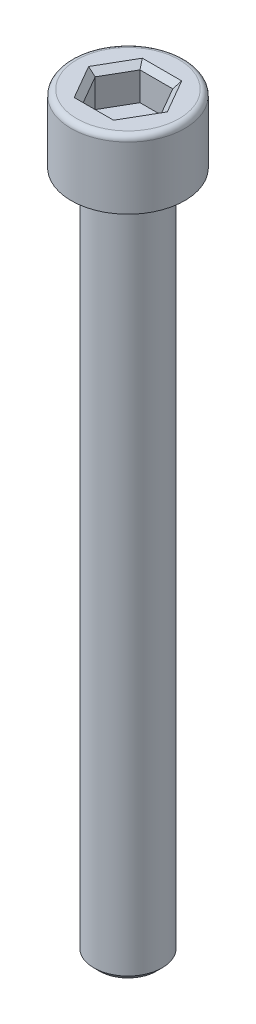
ISO-10303-21;
HEADER;
FILE_DESCRIPTION(('STEP AP214'),'2;1');
FILE_NAME('part.step','',(''),(''),'','','');
FILE_SCHEMA(('AUTOMOTIVE_DESIGN { 1 0 10303 214 1 1 1 1 }'));
ENDSEC;
DATA;
#1=APPLICATION_CONTEXT('core data for automotive mechanical design processes');
#2=APPLICATION_PROTOCOL_DEFINITION('international standard','automotive_design',2000,#1);
#3=PRODUCT_CONTEXT('',#1,'mechanical');
#4=PRODUCT('Part','Part','',(#3));
#5=PRODUCT_RELATED_PRODUCT_CATEGORY('part','',(#4));
#6=PRODUCT_DEFINITION_FORMATION('','',#4);
#7=PRODUCT_DEFINITION_CONTEXT('part definition',#1,'design');
#8=PRODUCT_DEFINITION('design','',#6,#7);
#9=PRODUCT_DEFINITION_SHAPE('','',#8);
#10=(LENGTH_UNIT() NAMED_UNIT(*) SI_UNIT(.MILLI.,.METRE.));
#11=(NAMED_UNIT(*) PLANE_ANGLE_UNIT() SI_UNIT($,.RADIAN.));
#12=(NAMED_UNIT(*) SI_UNIT($,.STERADIAN.) SOLID_ANGLE_UNIT());
#13=UNCERTAINTY_MEASURE_WITH_UNIT(LENGTH_MEASURE(1.E-05),#10,'distance_accuracy_value','');
#14=(GEOMETRIC_REPRESENTATION_CONTEXT(3) GLOBAL_UNCERTAINTY_ASSIGNED_CONTEXT((#13)) GLOBAL_UNIT_ASSIGNED_CONTEXT((#10,
#11,#12)) REPRESENTATION_CONTEXT('',''));
#15=CARTESIAN_POINT('',(0.,0.,0.));
#16=DIRECTION('',(0.,0.,1.));
#17=DIRECTION('',(1.,0.,0.));
#18=AXIS2_PLACEMENT_3D('',#15,#16,#17);
#19=CARTESIAN_POINT('',(0.,-60.,0.));
#20=DIRECTION('',(0.,1.,0.));
#21=DIRECTION('',(0.,0.,1.));
#22=AXIS2_PLACEMENT_3D('',#19,#20,#21);
#23=CYLINDRICAL_SURFACE('',#22,3.);
#24=CARTESIAN_POINT('',(0.,-59.5,0.));
#25=DIRECTION('',(0.,1.,0.));
#26=DIRECTION('',(0.,0.,1.));
#27=AXIS2_PLACEMENT_3D('',#24,#25,#26);
#28=CIRCLE('',#27,3.);
#29=CARTESIAN_POINT('',(0.,-59.5,3.));
#30=VERTEX_POINT('',#29);
#31=EDGE_CURVE('E41',#30,#30,#28,.T.);
#32=CARTESIAN_POINT('',(0.,0.,0.));
#33=DIRECTION('',(0.,1.,0.));
#34=DIRECTION('',(0.,0.,1.));
#35=AXIS2_PLACEMENT_3D('',#32,#33,#34);
#36=CIRCLE('',#35,3.);
#37=CARTESIAN_POINT('',(0.,0.,3.));
#38=VERTEX_POINT('',#37);
#39=EDGE_CURVE('E153',#38,#38,#36,.T.);
#40=CARTESIAN_POINT('',(0.,-59.5,3.));
#41=CARTESIAN_POINT('',(0.,-58.8802083333333,3.));
#42=CARTESIAN_POINT('',(0.,-58.2604166666666,3.));
#43=CARTESIAN_POINT('',(0.,-57.0208333333333,3.));
#44=CARTESIAN_POINT('',(0.,-56.4010416666666,3.));
#45=CARTESIAN_POINT('',(0.,-55.1614583333333,3.));
#46=CARTESIAN_POINT('',(0.,-54.5416666666666,3.));
#47=CARTESIAN_POINT('',(0.,-53.3020833333333,3.));
#48=CARTESIAN_POINT('',(0.,-52.6822916666666,3.));
#49=CARTESIAN_POINT('',(0.,-51.4427083333333,3.));
#50=CARTESIAN_POINT('',(0.,-50.8229166666666,3.));
#51=CARTESIAN_POINT('',(0.,-49.5833333333333,3.));
#52=CARTESIAN_POINT('',(0.,-48.9635416666666,3.));
#53=CARTESIAN_POINT('',(0.,-47.7239583333333,3.));
#54=CARTESIAN_POINT('',(0.,-47.1041666666666,3.));
#55=CARTESIAN_POINT('',(0.,-45.8645833333333,3.));
#56=CARTESIAN_POINT('',(0.,-45.2447916666666,3.));
#57=CARTESIAN_POINT('',(0.,-44.0052083333333,3.));
#58=CARTESIAN_POINT('',(0.,-43.3854166666666,3.));
#59=CARTESIAN_POINT('',(0.,-42.1458333333333,3.));
#60=CARTESIAN_POINT('',(0.,-41.5260416666666,3.));
#61=CARTESIAN_POINT('',(0.,-40.2864583333333,3.));
#62=CARTESIAN_POINT('',(0.,-39.6666666666667,3.));
#63=CARTESIAN_POINT('',(0.,-38.4270833333333,3.));
#64=CARTESIAN_POINT('',(0.,-37.8072916666667,3.));
#65=CARTESIAN_POINT('',(0.,-36.5677083333333,3.));
#66=CARTESIAN_POINT('',(0.,-35.9479166666667,3.));
#67=CARTESIAN_POINT('',(0.,-34.7083333333333,3.));
#68=CARTESIAN_POINT('',(0.,-34.0885416666667,3.));
#69=CARTESIAN_POINT('',(0.,-32.8489583333333,3.));
#70=CARTESIAN_POINT('',(0.,-32.2291666666667,3.));
#71=CARTESIAN_POINT('',(0.,-30.9895833333333,3.));
#72=CARTESIAN_POINT('',(0.,-30.3697916666667,3.));
#73=CARTESIAN_POINT('',(0.,-29.1302083333333,3.));
#74=CARTESIAN_POINT('',(0.,-28.5104166666667,3.));
#75=CARTESIAN_POINT('',(0.,-27.2708333333333,3.));
#76=CARTESIAN_POINT('',(0.,-26.6510416666667,3.));
#77=CARTESIAN_POINT('',(0.,-25.4114583333333,3.));
#78=CARTESIAN_POINT('',(0.,-24.7916666666667,3.));
#79=CARTESIAN_POINT('',(0.,-23.5520833333333,3.));
#80=CARTESIAN_POINT('',(0.,-22.9322916666667,3.));
#81=CARTESIAN_POINT('',(0.,-21.6927083333333,3.));
#82=CARTESIAN_POINT('',(0.,-21.0729166666667,3.));
#83=CARTESIAN_POINT('',(0.,-19.8333333333333,3.));
#84=CARTESIAN_POINT('',(0.,-19.2135416666667,3.));
#85=CARTESIAN_POINT('',(0.,-17.9739583333333,3.));
#86=CARTESIAN_POINT('',(0.,-17.3541666666667,3.));
#87=CARTESIAN_POINT('',(0.,-16.1145833333333,3.));
#88=CARTESIAN_POINT('',(0.,-15.4947916666667,3.));
#89=CARTESIAN_POINT('',(0.,-14.2552083333333,3.));
#90=CARTESIAN_POINT('',(0.,-13.6354166666667,3.));
#91=CARTESIAN_POINT('',(0.,-12.3958333333333,3.));
#92=CARTESIAN_POINT('',(0.,-11.7760416666667,3.));
#93=CARTESIAN_POINT('',(0.,-10.5364583333333,3.));
#94=CARTESIAN_POINT('',(0.,-9.91666666666666,3.));
#95=CARTESIAN_POINT('',(0.,-8.67708333333333,3.));
#96=CARTESIAN_POINT('',(0.,-8.05729166666667,3.));
#97=CARTESIAN_POINT('',(0.,-6.81770833333333,3.));
#98=CARTESIAN_POINT('',(0.,-6.19791666666666,3.));
#99=CARTESIAN_POINT('',(0.,-4.95833333333333,3.));
#100=CARTESIAN_POINT('',(0.,-4.33854166666667,3.));
#101=CARTESIAN_POINT('',(0.,-3.09895833333333,3.));
#102=CARTESIAN_POINT('',(0.,-2.47916666666666,3.));
#103=CARTESIAN_POINT('',(0.,-1.23958333333333,3.));
#104=CARTESIAN_POINT('',(0.,-0.619791666666667,3.));
#105=CARTESIAN_POINT('',(0.,0.,3.));
#106=B_SPLINE_CURVE_WITH_KNOTS('',3,(#40,#41,#42,#43,#44,#45,#46,#47,#48,#49,#50,#51,#52,#53,
#54,#55,#56,#57,#58,#59,#60,#61,#62,#63,#64,#65,#66,#67,#68,#69,#70,#71,#72,#73,#74,#75,#76,#77,
#78,#79,#80,#81,#82,#83,#84,#85,#86,#87,#88,#89,#90,#91,#92,#93,#94,#95,#96,#97,#98,#99,#100,
#101,#102,#103,#104,#105),.UNSPECIFIED.,.F.,.F.,(4,2,2,2,2,2,2,2,2,2,2,2,2,2,2,2,2,2,2,2,2,2,2,
2,2,2,2,2,2,2,2,2,4),(0.,1.859375,3.71874999999999,5.578125,7.43749999999999,9.29687499999999,
11.15625,13.015625,14.875,16.734375,18.59375,20.453125,22.3125,24.171875,26.03125,27.890625,
29.75,31.609375,33.46875,35.328125,37.1875,39.046875,40.90625,42.765625,44.625,46.484375,
48.34375,50.203125,52.0625,53.921875,55.78125,57.640625,59.5),.UNSPECIFIED.);
#107=EDGE_CURVE('BSEAM33',#30,#38,#106,.T.);
#108=ORIENTED_EDGE('',*,*,#31,.T.);
#109=ORIENTED_EDGE('',*,*,#39,.F.);
#110=ORIENTED_EDGE('',*,*,#107,.T.);
#111=ORIENTED_EDGE('',*,*,#107,.F.);
#112=EDGE_LOOP('',(#108,#110,#109,#111));
#113=FACE_BOUND('',#112,.T.);
#114=ADVANCED_FACE('F33',(#113),#23,.T.);
#115=CARTESIAN_POINT('',(0.,-60.,0.));
#116=DIRECTION('',(0.,1.,0.));
#117=DIRECTION('',(0.,0.,1.));
#118=AXIS2_PLACEMENT_3D('',#115,#116,#117);
#119=PLANE('',#118);
#120=CARTESIAN_POINT('',(0.,-60.,0.));
#121=DIRECTION('',(0.,1.,0.));
#122=DIRECTION('',(0.,0.,1.));
#123=AXIS2_PLACEMENT_3D('',#120,#121,#122);
#124=CIRCLE('',#123,2.49999999999996);
#125=CARTESIAN_POINT('',(0.,-60.,2.49999999999996));
#126=VERTEX_POINT('',#125);
#127=EDGE_CURVE('E11',#126,#126,#124,.F.);
#128=ORIENTED_EDGE('',*,*,#127,.T.);
#129=EDGE_LOOP('',(#128));
#130=FACE_BOUND('',#129,.T.);
#131=ADVANCED_FACE('F213',(#130),#119,.F.);
#132=CARTESIAN_POINT('',(0.,6.,0.));
#133=DIRECTION('',(0.,-1.,0.));
#134=DIRECTION('',(0.,0.,-1.));
#135=AXIS2_PLACEMENT_3D('',#132,#133,#134);
#136=CYLINDRICAL_SURFACE('',#135,5.);
#137=CARTESIAN_POINT('',(0.,5.5,0.));
#138=DIRECTION('',(0.,1.,0.));
#139=DIRECTION('',(0.,0.,1.));
#140=AXIS2_PLACEMENT_3D('',#137,#138,#139);
#141=CIRCLE('',#140,5.);
#142=CARTESIAN_POINT('',(0.,5.5,5.));
#143=VERTEX_POINT('',#142);
#144=EDGE_CURVE('E159',#143,#143,#141,.F.);
#145=ORIENTED_EDGE('',*,*,#144,.T.);
#146=EDGE_LOOP('',(#145));
#147=FACE_BOUND('',#146,.T.);
#148=CARTESIAN_POINT('',(0.,0.,0.));
#149=DIRECTION('',(0.,1.,0.));
#150=DIRECTION('',(0.,0.,1.));
#151=AXIS2_PLACEMENT_3D('',#148,#149,#150);
#152=CIRCLE('',#151,5.);
#153=CARTESIAN_POINT('',(0.,0.,5.));
#154=VERTEX_POINT('',#153);
#155=EDGE_CURVE('E141',#154,#154,#152,.T.);
#156=ORIENTED_EDGE('',*,*,#155,.T.);
#157=EDGE_LOOP('',(#156));
#158=FACE_BOUND('',#157,.T.);
#159=ADVANCED_FACE('F218',(#147,#158),#136,.T.);
#160=CARTESIAN_POINT('',(0.,6.,0.));
#161=DIRECTION('',(0.,1.,0.));
#162=DIRECTION('',(0.,0.,1.));
#163=AXIS2_PLACEMENT_3D('',#160,#161,#162);
#164=PLANE('',#163);
#165=DIRECTION('',(-1.,0.,0.));
#166=VECTOR('',#165,1.);
#167=CARTESIAN_POINT('',(-1.44337567297406,6.,3.));
#168=LINE('',#167,#166);
#169=CARTESIAN_POINT('',(1.73205080756888,6.,3.));
#170=VERTEX_POINT('',#169);
#171=CARTESIAN_POINT('',(-1.73205080756888,6.,3.));
#172=VERTEX_POINT('',#171);
#173=EDGE_CURVE('E165',#170,#172,#168,.T.);
#174=ORIENTED_EDGE('',*,*,#173,.T.);
#175=DIRECTION('',(-0.5,0.,-0.866025403784439));
#176=VECTOR('',#175,1.);
#177=CARTESIAN_POINT('',(-3.31976404784035,6.,0.250000000000001));
#178=LINE('',#177,#176);
#179=CARTESIAN_POINT('',(-3.46410161513776,6.,0.));
#180=VERTEX_POINT('',#179);
#181=EDGE_CURVE('E175',#172,#180,#178,.T.);
#182=ORIENTED_EDGE('',*,*,#181,.T.);
#183=DIRECTION('',(0.5,0.,-0.866025403784439));
#184=VECTOR('',#183,1.);
#185=CARTESIAN_POINT('',(-1.87638837486629,6.,-2.75));
#186=LINE('',#185,#184);
#187=CARTESIAN_POINT('',(-1.73205080756888,6.,-3.));
#188=VERTEX_POINT('',#187);
#189=EDGE_CURVE('E173',#180,#188,#186,.T.);
#190=ORIENTED_EDGE('',*,*,#189,.T.);
#191=DIRECTION('',(1.,0.,0.));
#192=VECTOR('',#191,1.);
#193=CARTESIAN_POINT('',(1.44337567297407,6.,-3.));
#194=LINE('',#193,#192);
#195=CARTESIAN_POINT('',(1.73205080756888,6.,-3.));
#196=VERTEX_POINT('',#195);
#197=EDGE_CURVE('E171',#188,#196,#194,.T.);
#198=ORIENTED_EDGE('',*,*,#197,.T.);
#199=DIRECTION('',(0.5,0.,0.866025403784439));
#200=VECTOR('',#199,1.);
#201=CARTESIAN_POINT('',(3.31976404784035,6.,-0.250000000000001));
#202=LINE('',#201,#200);
#203=CARTESIAN_POINT('',(3.46410161513776,6.,0.));
#204=VERTEX_POINT('',#203);
#205=EDGE_CURVE('E169',#196,#204,#202,.T.);
#206=ORIENTED_EDGE('',*,*,#205,.T.);
#207=DIRECTION('',(-0.5,0.,0.866025403784439));
#208=VECTOR('',#207,1.);
#209=CARTESIAN_POINT('',(1.87638837486629,6.,2.75));
#210=LINE('',#209,#208);
#211=EDGE_CURVE('E167',#204,#170,#210,.T.);
#212=ORIENTED_EDGE('',*,*,#211,.T.);
#213=EDGE_LOOP('',(#174,#182,#190,#198,#206,#212));
#214=FACE_BOUND('',#213,.T.);
#215=CARTESIAN_POINT('',(0.,6.,0.));
#216=DIRECTION('',(0.,1.,0.));
#217=DIRECTION('',(0.,0.,1.));
#218=AXIS2_PLACEMENT_3D('',#215,#216,#217);
#219=CIRCLE('',#218,4.5);
#220=CARTESIAN_POINT('',(0.,6.,4.5));
#221=VERTEX_POINT('',#220);
#222=EDGE_CURVE('E156',#221,#221,#219,.T.);
#223=ORIENTED_EDGE('',*,*,#222,.T.);
#224=EDGE_LOOP('',(#223));
#225=FACE_BOUND('',#224,.T.);
#226=ADVANCED_FACE('F256',(#214,#225),#164,.T.);
#227=CARTESIAN_POINT('',(0.,0.,0.));
#228=DIRECTION('',(0.,1.,0.));
#229=DIRECTION('',(0.,0.,1.));
#230=AXIS2_PLACEMENT_3D('',#227,#228,#229);
#231=PLANE('',#230);
#232=ORIENTED_EDGE('',*,*,#39,.T.);
#233=EDGE_LOOP('',(#232));
#234=FACE_BOUND('',#233,.T.);
#235=ORIENTED_EDGE('',*,*,#155,.F.);
#236=EDGE_LOOP('',(#235));
#237=FACE_BOUND('',#236,.T.);
#238=ADVANCED_FACE('F225',(#234,#237),#231,.F.);
#239=CARTESIAN_POINT('',(0.,5.5,0.));
#240=DIRECTION('',(0.,1.,0.));
#241=DIRECTION('',(0.,0.,1.));
#242=AXIS2_PLACEMENT_3D('',#239,#240,#241);
#243=TOROIDAL_SURFACE('',#242,4.5,0.5);
#244=ORIENTED_EDGE('',*,*,#144,.F.);
#245=EDGE_LOOP('',(#244));
#246=FACE_BOUND('',#245,.T.);
#247=ORIENTED_EDGE('',*,*,#222,.F.);
#248=EDGE_LOOP('',(#247));
#249=FACE_BOUND('',#248,.T.);
#250=ADVANCED_FACE('F223',(#246,#249),#243,.T.);
#251=CARTESIAN_POINT('',(1.44337567297407,3.,2.5));
#252=DIRECTION('',(0.866025403784439,0.,0.5));
#253=DIRECTION('',(0.5,0.,-0.866025403784439));
#254=AXIS2_PLACEMENT_3D('',#251,#252,#253);
#255=PLANE('',#254);
#256=DIRECTION('',(0.,1.,0.));
#257=VECTOR('',#256,1.);
#258=CARTESIAN_POINT('',(1.44337567297407,3.,2.5));
#259=LINE('',#258,#257);
#260=CARTESIAN_POINT('',(1.44337567297407,3.,2.5));
#261=VERTEX_POINT('',#260);
#262=CARTESIAN_POINT('',(1.44337567297407,5.50000000000001,2.5));
#263=VERTEX_POINT('',#262);
#264=EDGE_CURVE('E139',#261,#263,#259,.T.);
#265=ORIENTED_EDGE('',*,*,#264,.T.);
#266=DIRECTION('',(0.5,0.,-0.866025403784439));
#267=VECTOR('',#266,1.);
#268=CARTESIAN_POINT('',(2.88675134594813,5.50000000000001,0.));
#269=LINE('',#268,#267);
#270=CARTESIAN_POINT('',(2.88675134594813,5.50000000000001,0.));
#271=VERTEX_POINT('',#270);
#272=EDGE_CURVE('E55',#263,#271,#269,.T.);
#273=ORIENTED_EDGE('',*,*,#272,.T.);
#274=DIRECTION('',(0.,1.,0.));
#275=VECTOR('',#274,1.);
#276=CARTESIAN_POINT('',(2.88675134594813,3.,0.));
#277=LINE('',#276,#275);
#278=CARTESIAN_POINT('',(2.88675134594813,3.,0.));
#279=VERTEX_POINT('',#278);
#280=EDGE_CURVE('E103',#279,#271,#277,.T.);
#281=ORIENTED_EDGE('',*,*,#280,.F.);
#282=DIRECTION('',(0.5,0.,-0.866025403784439));
#283=VECTOR('',#282,1.);
#284=CARTESIAN_POINT('',(1.44337567297407,3.,2.5));
#285=LINE('',#284,#283);
#286=EDGE_CURVE('E107',#261,#279,#285,.T.);
#287=ORIENTED_EDGE('',*,*,#286,.F.);
#288=EDGE_LOOP('',(#265,#273,#281,#287));
#289=FACE_BOUND('',#288,.T.);
#290=ADVANCED_FACE('F105',(#289),#255,.F.);
#291=CARTESIAN_POINT('',(-1.44337567297406,3.,2.5));
#292=DIRECTION('',(0.,0.,1.));
#293=DIRECTION('',(1.,0.,0.));
#294=AXIS2_PLACEMENT_3D('',#291,#292,#293);
#295=PLANE('',#294);
#296=DIRECTION('',(0.,1.,0.));
#297=VECTOR('',#296,1.);
#298=CARTESIAN_POINT('',(-1.44337567297406,3.,2.5));
#299=LINE('',#298,#297);
#300=CARTESIAN_POINT('',(-1.44337567297406,3.,2.5));
#301=VERTEX_POINT('',#300);
#302=CARTESIAN_POINT('',(-1.44337567297406,5.50000000000001,2.5));
#303=VERTEX_POINT('',#302);
#304=EDGE_CURVE('E142',#301,#303,#299,.T.);
#305=ORIENTED_EDGE('',*,*,#304,.T.);
#306=DIRECTION('',(1.,0.,0.));
#307=VECTOR('',#306,1.);
#308=CARTESIAN_POINT('',(1.44337567297407,5.50000000000001,2.5));
#309=LINE('',#308,#307);
#310=EDGE_CURVE('E48',#303,#263,#309,.T.);
#311=ORIENTED_EDGE('',*,*,#310,.T.);
#312=ORIENTED_EDGE('',*,*,#264,.F.);
#313=DIRECTION('',(1.,0.,0.));
#314=VECTOR('',#313,1.);
#315=CARTESIAN_POINT('',(-1.44337567297406,3.,2.5));
#316=LINE('',#315,#314);
#317=EDGE_CURVE('E112',#301,#261,#316,.T.);
#318=ORIENTED_EDGE('',*,*,#317,.F.);
#319=EDGE_LOOP('',(#305,#311,#312,#318));
#320=FACE_BOUND('',#319,.T.);
#321=ADVANCED_FACE('F286',(#320),#295,.F.);
#322=CARTESIAN_POINT('',(-2.88675134594813,3.,0.));
#323=DIRECTION('',(-0.866025403784439,0.,0.5));
#324=DIRECTION('',(0.5,0.,0.866025403784439));
#325=AXIS2_PLACEMENT_3D('',#322,#323,#324);
#326=PLANE('',#325);
#327=DIRECTION('',(0.,1.,0.));
#328=VECTOR('',#327,1.);
#329=CARTESIAN_POINT('',(-2.88675134594813,3.,0.));
#330=LINE('',#329,#328);
#331=CARTESIAN_POINT('',(-2.88675134594813,3.,0.));
#332=VERTEX_POINT('',#331);
#333=CARTESIAN_POINT('',(-2.88675134594813,5.50000000000001,0.));
#334=VERTEX_POINT('',#333);
#335=EDGE_CURVE('E144',#332,#334,#330,.T.);
#336=ORIENTED_EDGE('',*,*,#335,.T.);
#337=DIRECTION('',(0.5,0.,0.866025403784439));
#338=VECTOR('',#337,1.);
#339=CARTESIAN_POINT('',(-1.44337567297406,5.50000000000001,2.5));
#340=LINE('',#339,#338);
#341=EDGE_CURVE('E162',#334,#303,#340,.T.);
#342=ORIENTED_EDGE('',*,*,#341,.T.);
#343=ORIENTED_EDGE('',*,*,#304,.F.);
#344=DIRECTION('',(0.5,0.,0.866025403784438));
#345=VECTOR('',#344,1.);
#346=CARTESIAN_POINT('',(-2.88675134594813,3.,0.));
#347=LINE('',#346,#345);
#348=EDGE_CURVE('E136',#332,#301,#347,.T.);
#349=ORIENTED_EDGE('',*,*,#348,.F.);
#350=EDGE_LOOP('',(#336,#342,#343,#349));
#351=FACE_BOUND('',#350,.T.);
#352=ADVANCED_FACE('F271',(#351),#326,.F.);
#353=CARTESIAN_POINT('',(-1.44337567297407,3.,-2.5));
#354=DIRECTION('',(-0.866025403784439,0.,-0.5));
#355=DIRECTION('',(-0.5,0.,0.866025403784439));
#356=AXIS2_PLACEMENT_3D('',#353,#354,#355);
#357=PLANE('',#356);
#358=DIRECTION('',(0.,1.,0.));
#359=VECTOR('',#358,1.);
#360=CARTESIAN_POINT('',(-1.44337567297407,3.,-2.5));
#361=LINE('',#360,#359);
#362=CARTESIAN_POINT('',(-1.44337567297407,3.,-2.5));
#363=VERTEX_POINT('',#362);
#364=CARTESIAN_POINT('',(-1.44337567297407,5.50000000000001,-2.5));
#365=VERTEX_POINT('',#364);
#366=EDGE_CURVE('E147',#363,#365,#361,.T.);
#367=ORIENTED_EDGE('',*,*,#366,.T.);
#368=DIRECTION('',(-0.5,0.,0.866025403784439));
#369=VECTOR('',#368,1.);
#370=CARTESIAN_POINT('',(-2.88675134594813,5.50000000000001,0.));
#371=LINE('',#370,#369);
#372=EDGE_CURVE('E178',#365,#334,#371,.T.);
#373=ORIENTED_EDGE('',*,*,#372,.T.);
#374=ORIENTED_EDGE('',*,*,#335,.F.);
#375=DIRECTION('',(-0.5,0.,0.866025403784439));
#376=VECTOR('',#375,1.);
#377=CARTESIAN_POINT('',(-1.44337567297407,3.,-2.5));
#378=LINE('',#377,#376);
#379=EDGE_CURVE('E133',#363,#332,#378,.T.);
#380=ORIENTED_EDGE('',*,*,#379,.F.);
#381=EDGE_LOOP('',(#367,#373,#374,#380));
#382=FACE_BOUND('',#381,.T.);
#383=ADVANCED_FACE('F267',(#382),#357,.F.);
#384=CARTESIAN_POINT('',(1.44337567297407,3.,-2.5));
#385=DIRECTION('',(0.,0.,-1.));
#386=DIRECTION('',(-1.,0.,0.));
#387=AXIS2_PLACEMENT_3D('',#384,#385,#386);
#388=PLANE('',#387);
#389=DIRECTION('',(0.,1.,0.));
#390=VECTOR('',#389,1.);
#391=CARTESIAN_POINT('',(1.44337567297407,3.,-2.5));
#392=LINE('',#391,#390);
#393=CARTESIAN_POINT('',(1.44337567297407,3.,-2.5));
#394=VERTEX_POINT('',#393);
#395=CARTESIAN_POINT('',(1.44337567297407,5.50000000000001,-2.5));
#396=VERTEX_POINT('',#395);
#397=EDGE_CURVE('E111',#394,#396,#392,.T.);
#398=ORIENTED_EDGE('',*,*,#397,.T.);
#399=DIRECTION('',(-1.,0.,0.));
#400=VECTOR('',#399,1.);
#401=CARTESIAN_POINT('',(-1.44337567297407,5.50000000000001,-2.5));
#402=LINE('',#401,#400);
#403=EDGE_CURVE('E180',#396,#365,#402,.T.);
#404=ORIENTED_EDGE('',*,*,#403,.T.);
#405=ORIENTED_EDGE('',*,*,#366,.F.);
#406=DIRECTION('',(-1.,0.,0.));
#407=VECTOR('',#406,1.);
#408=CARTESIAN_POINT('',(1.44337567297407,3.,-2.5));
#409=LINE('',#408,#407);
#410=EDGE_CURVE('E121',#394,#363,#409,.T.);
#411=ORIENTED_EDGE('',*,*,#410,.F.);
#412=EDGE_LOOP('',(#398,#404,#405,#411));
#413=FACE_BOUND('',#412,.T.);
#414=ADVANCED_FACE('F273',(#413),#388,.F.);
#415=CARTESIAN_POINT('',(2.88675134594813,3.,0.));
#416=DIRECTION('',(0.866025403784439,0.,-0.5));
#417=DIRECTION('',(-0.5,0.,-0.866025403784439));
#418=AXIS2_PLACEMENT_3D('',#415,#416,#417);
#419=PLANE('',#418);
#420=ORIENTED_EDGE('',*,*,#280,.T.);
#421=DIRECTION('',(-0.5,0.,-0.866025403784439));
#422=VECTOR('',#421,1.);
#423=CARTESIAN_POINT('',(1.44337567297407,5.50000000000001,-2.5));
#424=LINE('',#423,#422);
#425=EDGE_CURVE('E182',#271,#396,#424,.T.);
#426=ORIENTED_EDGE('',*,*,#425,.T.);
#427=ORIENTED_EDGE('',*,*,#397,.F.);
#428=DIRECTION('',(-0.5,0.,-0.866025403784439));
#429=VECTOR('',#428,1.);
#430=CARTESIAN_POINT('',(2.88675134594813,3.,0.));
#431=LINE('',#430,#429);
#432=EDGE_CURVE('E115',#279,#394,#431,.T.);
#433=ORIENTED_EDGE('',*,*,#432,.F.);
#434=EDGE_LOOP('',(#420,#426,#427,#433));
#435=FACE_BOUND('',#434,.T.);
#436=ADVANCED_FACE('F116',(#435),#419,.F.);
#437=CARTESIAN_POINT('',(0.,3.,0.));
#438=DIRECTION('',(0.,1.,0.));
#439=DIRECTION('',(0.,0.,1.));
#440=AXIS2_PLACEMENT_3D('',#437,#438,#439);
#441=PLANE('',#440);
#442=ORIENTED_EDGE('',*,*,#286,.T.);
#443=ORIENTED_EDGE('',*,*,#432,.T.);
#444=ORIENTED_EDGE('',*,*,#410,.T.);
#445=ORIENTED_EDGE('',*,*,#379,.T.);
#446=ORIENTED_EDGE('',*,*,#348,.T.);
#447=ORIENTED_EDGE('',*,*,#317,.T.);
#448=EDGE_LOOP('',(#442,#443,#444,#445,#446,#447));
#449=FACE_BOUND('',#448,.T.);
#450=ADVANCED_FACE('F123',(#449),#441,.T.);
#451=CARTESIAN_POINT('',(2.88675134594813,5.50000000000001,0.));
#452=DIRECTION('',(-0.61237243569579,0.707106781186552,0.353553390593271));
#453=DIRECTION('',(0.5,0.,0.866025403784439));
#454=AXIS2_PLACEMENT_3D('',#451,#452,#453);
#455=PLANE('',#454);
#456=DIRECTION('',(-0.755928946018459,-0.654653670707972,0.));
#457=VECTOR('',#456,1.);
#458=CARTESIAN_POINT('',(2.88675134594813,5.50000000000001,0.));
#459=LINE('',#458,#457);
#460=EDGE_CURVE('E129',#204,#271,#459,.T.);
#461=ORIENTED_EDGE('',*,*,#460,.F.);
#462=ORIENTED_EDGE('',*,*,#205,.F.);
#463=DIRECTION('',(-0.377964473009229,-0.654653670707972,0.654653670707981));
#464=VECTOR('',#463,1.);
#465=CARTESIAN_POINT('',(1.44337567297407,5.50000000000001,-2.5));
#466=LINE('',#465,#464);
#467=EDGE_CURVE('E126',#396,#196,#466,.F.);
#468=ORIENTED_EDGE('',*,*,#467,.F.);
#469=ORIENTED_EDGE('',*,*,#425,.F.);
#470=EDGE_LOOP('',(#461,#462,#468,#469));
#471=FACE_BOUND('',#470,.T.);
#472=ADVANCED_FACE('F241',(#471),#455,.T.);
#473=CARTESIAN_POINT('',(1.44337567297407,5.50000000000001,-2.5));
#474=DIRECTION('',(0.,0.707106781186553,0.707106781186542));
#475=DIRECTION('',(1.,0.,0.));
#476=AXIS2_PLACEMENT_3D('',#473,#474,#475);
#477=PLANE('',#476);
#478=ORIENTED_EDGE('',*,*,#467,.T.);
#479=ORIENTED_EDGE('',*,*,#197,.F.);
#480=DIRECTION('',(0.37796447300923,-0.654653670707972,0.654653670707981));
#481=VECTOR('',#480,1.);
#482=CARTESIAN_POINT('',(-1.44337567297407,5.50000000000001,-2.5));
#483=LINE('',#482,#481);
#484=EDGE_CURVE('E193',#365,#188,#483,.F.);
#485=ORIENTED_EDGE('',*,*,#484,.F.);
#486=ORIENTED_EDGE('',*,*,#403,.F.);
#487=EDGE_LOOP('',(#478,#479,#485,#486));
#488=FACE_BOUND('',#487,.T.);
#489=ADVANCED_FACE('F238',(#488),#477,.T.);
#490=CARTESIAN_POINT('',(1.44337567297407,5.50000000000001,2.5));
#491=DIRECTION('',(-0.61237243569579,0.707106781186552,-0.353553390593271));
#492=DIRECTION('',(-0.5,0.,0.866025403784439));
#493=AXIS2_PLACEMENT_3D('',#490,#491,#492);
#494=PLANE('',#493);
#495=ORIENTED_EDGE('',*,*,#460,.T.);
#496=ORIENTED_EDGE('',*,*,#272,.F.);
#497=DIRECTION('',(-0.37796447300923,-0.654653670707972,-0.654653670707981));
#498=VECTOR('',#497,1.);
#499=CARTESIAN_POINT('',(1.44337567297407,5.50000000000001,2.5));
#500=LINE('',#499,#498);
#501=EDGE_CURVE('E190',#170,#263,#500,.T.);
#502=ORIENTED_EDGE('',*,*,#501,.F.);
#503=ORIENTED_EDGE('',*,*,#211,.F.);
#504=EDGE_LOOP('',(#495,#496,#502,#503));
#505=FACE_BOUND('',#504,.T.);
#506=ADVANCED_FACE('F234',(#505),#494,.T.);
#507=CARTESIAN_POINT('',(-1.44337567297407,5.50000000000001,-2.5));
#508=DIRECTION('',(0.61237243569579,0.707106781186553,0.353553390593271));
#509=DIRECTION('',(0.5,0.,-0.866025403784439));
#510=AXIS2_PLACEMENT_3D('',#507,#508,#509);
#511=PLANE('',#510);
#512=ORIENTED_EDGE('',*,*,#484,.T.);
#513=ORIENTED_EDGE('',*,*,#189,.F.);
#514=DIRECTION('',(0.755928946018459,-0.654653670707972,0.));
#515=VECTOR('',#514,1.);
#516=CARTESIAN_POINT('',(-2.88675134594813,5.50000000000001,0.));
#517=LINE('',#516,#515);
#518=EDGE_CURVE('E188',#334,#180,#517,.F.);
#519=ORIENTED_EDGE('',*,*,#518,.F.);
#520=ORIENTED_EDGE('',*,*,#372,.F.);
#521=EDGE_LOOP('',(#512,#513,#519,#520));
#522=FACE_BOUND('',#521,.T.);
#523=ADVANCED_FACE('F230',(#522),#511,.T.);
#524=CARTESIAN_POINT('',(-1.44337567297406,5.50000000000001,2.5));
#525=DIRECTION('',(0.,0.707106781186552,-0.707106781186543));
#526=DIRECTION('',(-1.,0.,0.));
#527=AXIS2_PLACEMENT_3D('',#524,#525,#526);
#528=PLANE('',#527);
#529=ORIENTED_EDGE('',*,*,#501,.T.);
#530=ORIENTED_EDGE('',*,*,#310,.F.);
#531=DIRECTION('',(-0.37796447300923,0.654653670707972,0.654653670707981));
#532=VECTOR('',#531,1.);
#533=CARTESIAN_POINT('',(-1.0309826235529,4.78571428571429,1.78571428571428));
#534=LINE('',#533,#532);
#535=EDGE_CURVE('E186',#172,#303,#534,.F.);
#536=ORIENTED_EDGE('',*,*,#535,.F.);
#537=ORIENTED_EDGE('',*,*,#173,.F.);
#538=EDGE_LOOP('',(#529,#530,#536,#537));
#539=FACE_BOUND('',#538,.T.);
#540=ADVANCED_FACE('F208',(#539),#528,.T.);
#541=CARTESIAN_POINT('',(-2.88675134594813,5.50000000000001,0.));
#542=DIRECTION('',(0.61237243569579,0.707106781186552,-0.353553390593271));
#543=DIRECTION('',(-0.5,0.,-0.866025403784439));
#544=AXIS2_PLACEMENT_3D('',#541,#542,#543);
#545=PLANE('',#544);
#546=ORIENTED_EDGE('',*,*,#518,.T.);
#547=ORIENTED_EDGE('',*,*,#181,.F.);
#548=ORIENTED_EDGE('',*,*,#535,.T.);
#549=ORIENTED_EDGE('',*,*,#341,.F.);
#550=EDGE_LOOP('',(#546,#547,#548,#549));
#551=FACE_BOUND('',#550,.T.);
#552=ADVANCED_FACE('F203',(#551),#545,.T.);
#553=CARTESIAN_POINT('',(0.,-59.5,0.));
#554=DIRECTION('',(0.,1.,0.));
#555=DIRECTION('',(0.,0.,1.));
#556=AXIS2_PLACEMENT_3D('',#553,#554,#555);
#557=CONICAL_SURFACE('',#556,3.,0.785398163397447);
#558=ORIENTED_EDGE('',*,*,#127,.F.);
#559=EDGE_LOOP('',(#558));
#560=FACE_BOUND('',#559,.T.);
#561=ORIENTED_EDGE('',*,*,#31,.F.);
#562=EDGE_LOOP('',(#561));
#563=FACE_BOUND('',#562,.T.);
#564=ADVANCED_FACE('F35',(#560,#563),#557,.T.);
#565=CLOSED_SHELL('',(#114,#131,#159,#226,#238,#250,#290,#321,#352,#383,#414,#436,#450,#472,
#489,#506,#523,#540,#552,#564));
#566=MANIFOLD_SOLID_BREP('B2',#565);
#567=ADVANCED_BREP_SHAPE_REPRESENTATION('',(#18,#566),#14);
#568=SHAPE_DEFINITION_REPRESENTATION(#9,#567);
ENDSEC;
END-ISO-10303-21;
